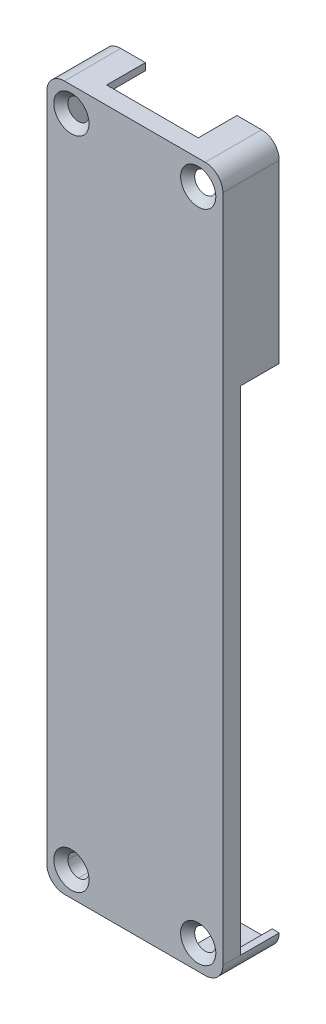
ISO-10303-21;
HEADER;
FILE_DESCRIPTION(('STEP AP214'),'2;1');
FILE_NAME('part.step','',(''),(''),'','','');
FILE_SCHEMA(('AUTOMOTIVE_DESIGN { 1 0 10303 214 1 1 1 1 }'));
ENDSEC;
DATA;
#1=APPLICATION_CONTEXT('core data for automotive mechanical design processes');
#2=APPLICATION_PROTOCOL_DEFINITION('international standard','automotive_design',2000,#1);
#3=PRODUCT_CONTEXT('',#1,'mechanical');
#4=PRODUCT('Part','Part','',(#3));
#5=PRODUCT_RELATED_PRODUCT_CATEGORY('part','',(#4));
#6=PRODUCT_DEFINITION_FORMATION('','',#4);
#7=PRODUCT_DEFINITION_CONTEXT('part definition',#1,'design');
#8=PRODUCT_DEFINITION('design','',#6,#7);
#9=PRODUCT_DEFINITION_SHAPE('','',#8);
#10=(LENGTH_UNIT() NAMED_UNIT(*) SI_UNIT(.MILLI.,.METRE.));
#11=(NAMED_UNIT(*) PLANE_ANGLE_UNIT() SI_UNIT($,.RADIAN.));
#12=(NAMED_UNIT(*) SI_UNIT($,.STERADIAN.) SOLID_ANGLE_UNIT());
#13=UNCERTAINTY_MEASURE_WITH_UNIT(LENGTH_MEASURE(1.E-05),#10,'distance_accuracy_value','');
#14=(GEOMETRIC_REPRESENTATION_CONTEXT(3) GLOBAL_UNCERTAINTY_ASSIGNED_CONTEXT((#13)) GLOBAL_UNIT_ASSIGNED_CONTEXT((#10,
#11,#12)) REPRESENTATION_CONTEXT('',''));
#15=CARTESIAN_POINT('',(0.,0.,0.));
#16=DIRECTION('',(0.,0.,1.));
#17=DIRECTION('',(1.,0.,0.));
#18=AXIS2_PLACEMENT_3D('',#15,#16,#17);
#19=CARTESIAN_POINT('',(0.,0.,0.));
#20=DIRECTION('',(0.,0.,1.));
#21=DIRECTION('',(1.,0.,0.));
#22=AXIS2_PLACEMENT_3D('',#19,#20,#21);
#23=PLANE('',#22);
#24=CARTESIAN_POINT('',(20.,-95.,0.));
#25=DIRECTION('',(0.,0.,1.));
#26=DIRECTION('',(1.,0.,0.));
#27=AXIS2_PLACEMENT_3D('',#24,#25,#26);
#28=CIRCLE('',#27,3.);
#29=CARTESIAN_POINT('',(23.,-95.,0.));
#30=VERTEX_POINT('',#29);
#31=CARTESIAN_POINT('',(20.,-98.,0.));
#32=VERTEX_POINT('',#31);
#33=EDGE_CURVE('E458',#30,#32,#28,.F.);
#34=ORIENTED_EDGE('',*,*,#33,.F.);
#35=DIRECTION('',(1.,0.,0.));
#36=VECTOR('',#35,1.);
#37=CARTESIAN_POINT('',(18.,-95.,0.));
#38=LINE('',#37,#36);
#39=CARTESIAN_POINT('',(25.,-95.,0.));
#40=VERTEX_POINT('',#39);
#41=EDGE_CURVE('E562',#30,#40,#38,.T.);
#42=ORIENTED_EDGE('',*,*,#41,.T.);
#43=CARTESIAN_POINT('',(20.,-95.,0.));
#44=DIRECTION('',(0.,0.,1.));
#45=DIRECTION('',(1.,0.,0.));
#46=AXIS2_PLACEMENT_3D('',#43,#44,#45);
#47=CIRCLE('',#46,5.);
#48=CARTESIAN_POINT('',(20.,-100.,0.));
#49=VERTEX_POINT('',#48);
#50=EDGE_CURVE('E270',#40,#49,#47,.F.);
#51=ORIENTED_EDGE('',*,*,#50,.T.);
#52=DIRECTION('',(1.,0.,0.));
#53=VECTOR('',#52,1.);
#54=CARTESIAN_POINT('',(-25.,-100.,0.));
#55=LINE('',#54,#53);
#56=CARTESIAN_POINT('',(13.,-100.,0.));
#57=VERTEX_POINT('',#56);
#58=EDGE_CURVE('E256',#57,#49,#55,.T.);
#59=ORIENTED_EDGE('',*,*,#58,.F.);
#60=DIRECTION('',(0.,-1.,0.));
#61=VECTOR('',#60,1.);
#62=CARTESIAN_POINT('',(13.,602.219050371606,0.));
#63=LINE('',#62,#61);
#64=CARTESIAN_POINT('',(13.,-98.,0.));
#65=VERTEX_POINT('',#64);
#66=EDGE_CURVE('E494',#65,#57,#63,.T.);
#67=ORIENTED_EDGE('',*,*,#66,.F.);
#68=DIRECTION('',(1.,0.,0.));
#69=VECTOR('',#68,1.);
#70=CARTESIAN_POINT('',(-25.,-98.,0.));
#71=LINE('',#70,#69);
#72=EDGE_CURVE('E463',#65,#32,#71,.T.);
#73=ORIENTED_EDGE('',*,*,#72,.T.);
#74=EDGE_LOOP('',(#34,#42,#51,#59,#67,#73));
#75=FACE_BOUND('',#74,.T.);
#76=ADVANCED_FACE('F36',(#75),#23,.F.);
#77=CARTESIAN_POINT('',(0.,0.,16.));
#78=DIRECTION('',(0.,0.,1.));
#79=DIRECTION('',(1.,0.,0.));
#80=AXIS2_PLACEMENT_3D('',#77,#78,#79);
#81=PLANE('',#80);
#82=CARTESIAN_POINT('',(-18.,-93.,16.));
#83=DIRECTION('',(0.,0.,1.));
#84=DIRECTION('',(1.,0.,0.));
#85=AXIS2_PLACEMENT_3D('',#82,#83,#84);
#86=CIRCLE('',#85,5.);
#87=CARTESIAN_POINT('',(-13.,-93.,16.));
#88=VERTEX_POINT('',#87);
#89=EDGE_CURVE('E11',#88,#88,#86,.F.);
#90=ORIENTED_EDGE('',*,*,#89,.T.);
#91=EDGE_LOOP('',(#90));
#92=FACE_BOUND('',#91,.T.);
#93=CARTESIAN_POINT('',(18.,-93.,16.));
#94=DIRECTION('',(0.,0.,1.));
#95=DIRECTION('',(1.,0.,0.));
#96=AXIS2_PLACEMENT_3D('',#93,#94,#95);
#97=CIRCLE('',#96,5.);
#98=CARTESIAN_POINT('',(23.,-93.,16.));
#99=VERTEX_POINT('',#98);
#100=EDGE_CURVE('E44',#99,#99,#97,.F.);
#101=ORIENTED_EDGE('',*,*,#100,.T.);
#102=EDGE_LOOP('',(#101));
#103=FACE_BOUND('',#102,.T.);
#104=CARTESIAN_POINT('',(-18.,93.,16.));
#105=DIRECTION('',(0.,0.,1.));
#106=DIRECTION('',(1.,0.,0.));
#107=AXIS2_PLACEMENT_3D('',#104,#105,#106);
#108=CIRCLE('',#107,5.00000000000006);
#109=CARTESIAN_POINT('',(-13.,93.,16.));
#110=VERTEX_POINT('',#109);
#111=EDGE_CURVE('E323',#110,#110,#108,.F.);
#112=ORIENTED_EDGE('',*,*,#111,.T.);
#113=EDGE_LOOP('',(#112));
#114=FACE_BOUND('',#113,.T.);
#115=CARTESIAN_POINT('',(18.,93.,16.));
#116=DIRECTION('',(0.,0.,1.));
#117=DIRECTION('',(1.,0.,0.));
#118=AXIS2_PLACEMENT_3D('',#115,#116,#117);
#119=CIRCLE('',#118,5.00000000000006);
#120=CARTESIAN_POINT('',(23.0000000000001,93.,16.));
#121=VERTEX_POINT('',#120);
#122=EDGE_CURVE('E320',#121,#121,#119,.F.);
#123=ORIENTED_EDGE('',*,*,#122,.T.);
#124=EDGE_LOOP('',(#123));
#125=FACE_BOUND('',#124,.T.);
#126=DIRECTION('',(0.,-1.,0.));
#127=VECTOR('',#126,1.);
#128=CARTESIAN_POINT('',(-25.,100.,16.));
#129=LINE('',#128,#127);
#130=CARTESIAN_POINT('',(-25.,95.,16.));
#131=VERTEX_POINT('',#130);
#132=CARTESIAN_POINT('',(-25.,-95.,16.));
#133=VERTEX_POINT('',#132);
#134=EDGE_CURVE('E394',#131,#133,#129,.T.);
#135=ORIENTED_EDGE('',*,*,#134,.T.);
#136=CARTESIAN_POINT('',(-20.,-95.,16.));
#137=DIRECTION('',(0.,0.,1.));
#138=DIRECTION('',(1.,0.,0.));
#139=AXIS2_PLACEMENT_3D('',#136,#137,#138);
#140=CIRCLE('',#139,5.);
#141=CARTESIAN_POINT('',(-20.,-100.,16.));
#142=VERTEX_POINT('',#141);
#143=EDGE_CURVE('E286',#133,#142,#140,.T.);
#144=ORIENTED_EDGE('',*,*,#143,.T.);
#145=DIRECTION('',(1.,0.,0.));
#146=VECTOR('',#145,1.);
#147=CARTESIAN_POINT('',(-25.,-100.,16.));
#148=LINE('',#147,#146);
#149=CARTESIAN_POINT('',(20.,-100.,16.));
#150=VERTEX_POINT('',#149);
#151=EDGE_CURVE('E249',#142,#150,#148,.T.);
#152=ORIENTED_EDGE('',*,*,#151,.T.);
#153=CARTESIAN_POINT('',(20.,-95.,16.));
#154=DIRECTION('',(0.,0.,1.));
#155=DIRECTION('',(1.,0.,0.));
#156=AXIS2_PLACEMENT_3D('',#153,#154,#155);
#157=CIRCLE('',#156,5.);
#158=CARTESIAN_POINT('',(25.,-95.,16.));
#159=VERTEX_POINT('',#158);
#160=EDGE_CURVE('E284',#150,#159,#157,.T.);
#161=ORIENTED_EDGE('',*,*,#160,.T.);
#162=DIRECTION('',(0.,1.,0.));
#163=VECTOR('',#162,1.);
#164=CARTESIAN_POINT('',(25.,100.,16.));
#165=LINE('',#164,#163);
#166=CARTESIAN_POINT('',(25.,95.,16.));
#167=VERTEX_POINT('',#166);
#168=EDGE_CURVE('E260',#159,#167,#165,.T.);
#169=ORIENTED_EDGE('',*,*,#168,.T.);
#170=CARTESIAN_POINT('',(20.,95.,16.));
#171=DIRECTION('',(0.,0.,1.));
#172=DIRECTION('',(1.,0.,0.));
#173=AXIS2_PLACEMENT_3D('',#170,#171,#172);
#174=CIRCLE('',#173,5.);
#175=CARTESIAN_POINT('',(20.,100.,16.));
#176=VERTEX_POINT('',#175);
#177=EDGE_CURVE('E280',#167,#176,#174,.T.);
#178=ORIENTED_EDGE('',*,*,#177,.T.);
#179=DIRECTION('',(-1.,0.,0.));
#180=VECTOR('',#179,1.);
#181=CARTESIAN_POINT('',(-25.,100.,16.));
#182=LINE('',#181,#180);
#183=CARTESIAN_POINT('',(-20.,100.,16.));
#184=VERTEX_POINT('',#183);
#185=EDGE_CURVE('E477',#176,#184,#182,.T.);
#186=ORIENTED_EDGE('',*,*,#185,.T.);
#187=CARTESIAN_POINT('',(-20.,95.,16.));
#188=DIRECTION('',(0.,0.,1.));
#189=DIRECTION('',(1.,0.,0.));
#190=AXIS2_PLACEMENT_3D('',#187,#188,#189);
#191=CIRCLE('',#190,5.);
#192=EDGE_CURVE('E282',#184,#131,#191,.T.);
#193=ORIENTED_EDGE('',*,*,#192,.T.);
#194=EDGE_LOOP('',(#135,#144,#152,#161,#169,#178,#186,#193));
#195=FACE_BOUND('',#194,.T.);
#196=ADVANCED_FACE('F328',(#92,#103,#114,#125,#195),#81,.T.);
#197=CARTESIAN_POINT('',(0.,0.,14.));
#198=DIRECTION('',(0.,0.,1.));
#199=DIRECTION('',(1.,0.,0.));
#200=AXIS2_PLACEMENT_3D('',#197,#198,#199);
#201=PLANE('',#200);
#202=CARTESIAN_POINT('',(-18.,-93.,14.));
#203=DIRECTION('',(0.,0.,1.));
#204=DIRECTION('',(1.,0.,0.));
#205=AXIS2_PLACEMENT_3D('',#202,#203,#204);
#206=CIRCLE('',#205,3.);
#207=CARTESIAN_POINT('',(-15.,-93.,14.));
#208=VERTEX_POINT('',#207);
#209=EDGE_CURVE('E312',#208,#208,#206,.F.);
#210=ORIENTED_EDGE('',*,*,#209,.F.);
#211=EDGE_LOOP('',(#210));
#212=FACE_BOUND('',#211,.T.);
#213=CARTESIAN_POINT('',(18.,93.,14.));
#214=DIRECTION('',(0.,0.,1.));
#215=DIRECTION('',(1.,0.,0.));
#216=AXIS2_PLACEMENT_3D('',#213,#214,#215);
#217=CIRCLE('',#216,3.);
#218=CARTESIAN_POINT('',(21.,93.,14.));
#219=VERTEX_POINT('',#218);
#220=EDGE_CURVE('E309',#219,#219,#217,.T.);
#221=ORIENTED_EDGE('',*,*,#220,.T.);
#222=EDGE_LOOP('',(#221));
#223=FACE_BOUND('',#222,.T.);
#224=CARTESIAN_POINT('',(-18.,93.,14.));
#225=DIRECTION('',(0.,0.,1.));
#226=DIRECTION('',(1.,0.,0.));
#227=AXIS2_PLACEMENT_3D('',#224,#225,#226);
#228=CIRCLE('',#227,3.);
#229=CARTESIAN_POINT('',(-15.,93.,14.));
#230=VERTEX_POINT('',#229);
#231=EDGE_CURVE('E306',#230,#230,#228,.T.);
#232=ORIENTED_EDGE('',*,*,#231,.T.);
#233=EDGE_LOOP('',(#232));
#234=FACE_BOUND('',#233,.T.);
#235=DIRECTION('',(0.,-1.,0.));
#236=VECTOR('',#235,1.);
#237=CARTESIAN_POINT('',(-23.,100.,14.));
#238=LINE('',#237,#236);
#239=CARTESIAN_POINT('',(-23.,95.,14.));
#240=VERTEX_POINT('',#239);
#241=CARTESIAN_POINT('',(-23.,-95.,14.));
#242=VERTEX_POINT('',#241);
#243=EDGE_CURVE('E432',#240,#242,#238,.T.);
#244=ORIENTED_EDGE('',*,*,#243,.F.);
#245=CARTESIAN_POINT('',(-20.,95.,14.));
#246=DIRECTION('',(0.,0.,1.));
#247=DIRECTION('',(1.,0.,0.));
#248=AXIS2_PLACEMENT_3D('',#245,#246,#247);
#249=CIRCLE('',#248,3.);
#250=CARTESIAN_POINT('',(-20.,98.,14.));
#251=VERTEX_POINT('',#250);
#252=EDGE_CURVE('E442',#251,#240,#249,.T.);
#253=ORIENTED_EDGE('',*,*,#252,.F.);
#254=DIRECTION('',(-1.,0.,0.));
#255=VECTOR('',#254,1.);
#256=CARTESIAN_POINT('',(-25.,98.,14.));
#257=LINE('',#256,#255);
#258=CARTESIAN_POINT('',(20.,98.,14.));
#259=VERTEX_POINT('',#258);
#260=EDGE_CURVE('E424',#259,#251,#257,.T.);
#261=ORIENTED_EDGE('',*,*,#260,.F.);
#262=CARTESIAN_POINT('',(20.,95.,14.));
#263=DIRECTION('',(0.,0.,1.));
#264=DIRECTION('',(1.,0.,0.));
#265=AXIS2_PLACEMENT_3D('',#262,#263,#264);
#266=CIRCLE('',#265,3.);
#267=CARTESIAN_POINT('',(23.,95.,14.));
#268=VERTEX_POINT('',#267);
#269=EDGE_CURVE('E443',#268,#259,#266,.T.);
#270=ORIENTED_EDGE('',*,*,#269,.F.);
#271=DIRECTION('',(0.,1.,0.));
#272=VECTOR('',#271,1.);
#273=CARTESIAN_POINT('',(23.,100.,14.));
#274=LINE('',#273,#272);
#275=CARTESIAN_POINT('',(23.,-95.,14.));
#276=VERTEX_POINT('',#275);
#277=EDGE_CURVE('E421',#276,#268,#274,.T.);
#278=ORIENTED_EDGE('',*,*,#277,.F.);
#279=CARTESIAN_POINT('',(20.,-95.,14.));
#280=DIRECTION('',(0.,0.,1.));
#281=DIRECTION('',(1.,0.,0.));
#282=AXIS2_PLACEMENT_3D('',#279,#280,#281);
#283=CIRCLE('',#282,3.);
#284=CARTESIAN_POINT('',(20.,-98.,14.));
#285=VERTEX_POINT('',#284);
#286=EDGE_CURVE('E437',#285,#276,#283,.T.);
#287=ORIENTED_EDGE('',*,*,#286,.F.);
#288=DIRECTION('',(1.,0.,0.));
#289=VECTOR('',#288,1.);
#290=CARTESIAN_POINT('',(-25.,-98.,14.));
#291=LINE('',#290,#289);
#292=CARTESIAN_POINT('',(-20.,-98.,14.));
#293=VERTEX_POINT('',#292);
#294=EDGE_CURVE('E435',#293,#285,#291,.T.);
#295=ORIENTED_EDGE('',*,*,#294,.F.);
#296=CARTESIAN_POINT('',(-20.,-95.,14.));
#297=DIRECTION('',(0.,0.,1.));
#298=DIRECTION('',(1.,0.,0.));
#299=AXIS2_PLACEMENT_3D('',#296,#297,#298);
#300=CIRCLE('',#299,3.);
#301=EDGE_CURVE('E431',#242,#293,#300,.T.);
#302=ORIENTED_EDGE('',*,*,#301,.F.);
#303=EDGE_LOOP('',(#244,#253,#261,#270,#278,#287,#295,#302));
#304=FACE_BOUND('',#303,.T.);
#305=CARTESIAN_POINT('',(18.,-93.,14.));
#306=DIRECTION('',(0.,0.,1.));
#307=DIRECTION('',(1.,0.,0.));
#308=AXIS2_PLACEMENT_3D('',#305,#306,#307);
#309=CIRCLE('',#308,3.);
#310=CARTESIAN_POINT('',(21.,-93.,14.));
#311=VERTEX_POINT('',#310);
#312=EDGE_CURVE('E315',#311,#311,#309,.F.);
#313=ORIENTED_EDGE('',*,*,#312,.F.);
#314=EDGE_LOOP('',(#313));
#315=FACE_BOUND('',#314,.T.);
#316=ADVANCED_FACE('F352',(#212,#223,#234,#304,#315),#201,.F.);
#317=CARTESIAN_POINT('',(-25.,100.,16.));
#318=DIRECTION('',(0.,-1.,0.));
#319=DIRECTION('',(0.,0.,-1.));
#320=AXIS2_PLACEMENT_3D('',#317,#318,#319);
#321=PLANE('',#320);
#322=DIRECTION('',(0.,0.,1.));
#323=VECTOR('',#322,1.);
#324=CARTESIAN_POINT('',(-13.,100.,16.));
#325=LINE('',#324,#323);
#326=CARTESIAN_POINT('',(-13.,100.,0.));
#327=VERTEX_POINT('',#326);
#328=CARTESIAN_POINT('',(-13.,100.,11.));
#329=VERTEX_POINT('',#328);
#330=EDGE_CURVE('E407',#327,#329,#325,.T.);
#331=ORIENTED_EDGE('',*,*,#330,.F.);
#332=DIRECTION('',(-1.,0.,0.));
#333=VECTOR('',#332,1.);
#334=CARTESIAN_POINT('',(-25.,100.,0.));
#335=LINE('',#334,#333);
#336=CARTESIAN_POINT('',(-20.,100.,0.));
#337=VERTEX_POINT('',#336);
#338=EDGE_CURVE('E241',#327,#337,#335,.T.);
#339=ORIENTED_EDGE('',*,*,#338,.T.);
#340=DIRECTION('',(0.,0.,-1.));
#341=VECTOR('',#340,1.);
#342=CARTESIAN_POINT('',(-20.,100.,16.));
#343=LINE('',#342,#341);
#344=EDGE_CURVE('E295',#337,#184,#343,.F.);
#345=ORIENTED_EDGE('',*,*,#344,.T.);
#346=ORIENTED_EDGE('',*,*,#185,.F.);
#347=DIRECTION('',(0.,0.,-1.));
#348=VECTOR('',#347,1.);
#349=CARTESIAN_POINT('',(20.,100.,16.));
#350=LINE('',#349,#348);
#351=CARTESIAN_POINT('',(20.,100.,0.));
#352=VERTEX_POINT('',#351);
#353=EDGE_CURVE('E292',#176,#352,#350,.T.);
#354=ORIENTED_EDGE('',*,*,#353,.T.);
#355=CARTESIAN_POINT('',(13.,100.,0.));
#356=VERTEX_POINT('',#355);
#357=EDGE_CURVE('E244',#352,#356,#335,.T.);
#358=ORIENTED_EDGE('',*,*,#357,.T.);
#359=DIRECTION('',(0.,0.,-1.));
#360=VECTOR('',#359,1.);
#361=CARTESIAN_POINT('',(13.,100.,16.));
#362=LINE('',#361,#360);
#363=CARTESIAN_POINT('',(13.,100.,11.));
#364=VERTEX_POINT('',#363);
#365=EDGE_CURVE('E506',#364,#356,#362,.T.);
#366=ORIENTED_EDGE('',*,*,#365,.F.);
#367=DIRECTION('',(1.,0.,0.));
#368=VECTOR('',#367,1.);
#369=CARTESIAN_POINT('',(-25.,100.,11.));
#370=LINE('',#369,#368);
#371=EDGE_CURVE('E409',#329,#364,#370,.T.);
#372=ORIENTED_EDGE('',*,*,#371,.F.);
#373=EDGE_LOOP('',(#331,#339,#345,#346,#354,#358,#366,#372));
#374=FACE_BOUND('',#373,.T.);
#375=ADVANCED_FACE('F365',(#374),#321,.F.);
#376=CARTESIAN_POINT('',(-25.,-100.,16.));
#377=DIRECTION('',(0.,1.,0.));
#378=DIRECTION('',(0.,0.,1.));
#379=AXIS2_PLACEMENT_3D('',#376,#377,#378);
#380=PLANE('',#379);
#381=DIRECTION('',(0.,0.,-1.));
#382=VECTOR('',#381,1.);
#383=CARTESIAN_POINT('',(-13.,-100.,16.));
#384=LINE('',#383,#382);
#385=CARTESIAN_POINT('',(-13.,-100.,11.));
#386=VERTEX_POINT('',#385);
#387=CARTESIAN_POINT('',(-13.,-100.,0.));
#388=VERTEX_POINT('',#387);
#389=EDGE_CURVE('E380',#386,#388,#384,.T.);
#390=ORIENTED_EDGE('',*,*,#389,.F.);
#391=DIRECTION('',(-1.,0.,0.));
#392=VECTOR('',#391,1.);
#393=CARTESIAN_POINT('',(-25.,-100.,11.));
#394=LINE('',#393,#392);
#395=CARTESIAN_POINT('',(13.,-100.,11.));
#396=VERTEX_POINT('',#395);
#397=EDGE_CURVE('E511',#396,#386,#394,.T.);
#398=ORIENTED_EDGE('',*,*,#397,.F.);
#399=DIRECTION('',(0.,0.,1.));
#400=VECTOR('',#399,1.);
#401=CARTESIAN_POINT('',(13.,-100.,16.));
#402=LINE('',#401,#400);
#403=EDGE_CURVE('E504',#57,#396,#402,.T.);
#404=ORIENTED_EDGE('',*,*,#403,.F.);
#405=ORIENTED_EDGE('',*,*,#58,.T.);
#406=DIRECTION('',(0.,0.,-1.));
#407=VECTOR('',#406,1.);
#408=CARTESIAN_POINT('',(20.,-100.,16.));
#409=LINE('',#408,#407);
#410=EDGE_CURVE('E261',#49,#150,#409,.F.);
#411=ORIENTED_EDGE('',*,*,#410,.T.);
#412=ORIENTED_EDGE('',*,*,#151,.F.);
#413=DIRECTION('',(0.,0.,-1.));
#414=VECTOR('',#413,1.);
#415=CARTESIAN_POINT('',(-20.,-100.,16.));
#416=LINE('',#415,#414);
#417=CARTESIAN_POINT('',(-20.,-100.,0.));
#418=VERTEX_POINT('',#417);
#419=EDGE_CURVE('E263',#142,#418,#416,.T.);
#420=ORIENTED_EDGE('',*,*,#419,.T.);
#421=EDGE_CURVE('E257',#418,#388,#55,.T.);
#422=ORIENTED_EDGE('',*,*,#421,.T.);
#423=EDGE_LOOP('',(#390,#398,#404,#405,#411,#412,#420,#422));
#424=FACE_BOUND('',#423,.T.);
#425=ADVANCED_FACE('F360',(#424),#380,.F.);
#426=DIRECTION('',(0.,-1.,0.));
#427=VECTOR('',#426,1.);
#428=CARTESIAN_POINT('',(-13.,602.219050371606,0.));
#429=LINE('',#428,#427);
#430=CARTESIAN_POINT('',(-13.,-98.,0.));
#431=VERTEX_POINT('',#430);
#432=EDGE_CURVE('E370',#431,#388,#429,.T.);
#433=ORIENTED_EDGE('',*,*,#432,.T.);
#434=ORIENTED_EDGE('',*,*,#421,.F.);
#435=CARTESIAN_POINT('',(-20.,-95.,0.));
#436=DIRECTION('',(0.,0.,1.));
#437=DIRECTION('',(1.,0.,0.));
#438=AXIS2_PLACEMENT_3D('',#435,#436,#437);
#439=CIRCLE('',#438,5.);
#440=CARTESIAN_POINT('',(-25.,-95.,0.));
#441=VERTEX_POINT('',#440);
#442=EDGE_CURVE('E273',#418,#441,#439,.F.);
#443=ORIENTED_EDGE('',*,*,#442,.T.);
#444=DIRECTION('',(0.,-1.,0.));
#445=VECTOR('',#444,1.);
#446=CARTESIAN_POINT('',(-25.,100.,0.));
#447=LINE('',#446,#445);
#448=CARTESIAN_POINT('',(-25.,95.,0.));
#449=VERTEX_POINT('',#448);
#450=EDGE_CURVE('E253',#449,#441,#447,.T.);
#451=ORIENTED_EDGE('',*,*,#450,.F.);
#452=CARTESIAN_POINT('',(-20.,95.,0.));
#453=DIRECTION('',(0.,0.,1.));
#454=DIRECTION('',(1.,0.,0.));
#455=AXIS2_PLACEMENT_3D('',#452,#453,#454);
#456=CIRCLE('',#455,5.);
#457=EDGE_CURVE('E267',#449,#337,#456,.F.);
#458=ORIENTED_EDGE('',*,*,#457,.T.);
#459=ORIENTED_EDGE('',*,*,#338,.F.);
#460=CARTESIAN_POINT('',(-13.,98.0000000000001,0.));
#461=VERTEX_POINT('',#460);
#462=EDGE_CURVE('E375',#327,#461,#429,.T.);
#463=ORIENTED_EDGE('',*,*,#462,.T.);
#464=DIRECTION('',(-1.,0.,0.));
#465=VECTOR('',#464,1.);
#466=CARTESIAN_POINT('',(-25.,98.,0.));
#467=LINE('',#466,#465);
#468=CARTESIAN_POINT('',(-20.,98.,0.));
#469=VERTEX_POINT('',#468);
#470=EDGE_CURVE('E415',#461,#469,#467,.T.);
#471=ORIENTED_EDGE('',*,*,#470,.T.);
#472=CARTESIAN_POINT('',(-20.,95.,0.));
#473=DIRECTION('',(0.,0.,1.));
#474=DIRECTION('',(1.,0.,0.));
#475=AXIS2_PLACEMENT_3D('',#472,#473,#474);
#476=CIRCLE('',#475,3.);
#477=CARTESIAN_POINT('',(-23.,95.,0.));
#478=VERTEX_POINT('',#477);
#479=EDGE_CURVE('E461',#478,#469,#476,.F.);
#480=ORIENTED_EDGE('',*,*,#479,.F.);
#481=DIRECTION('',(0.,-1.,0.));
#482=VECTOR('',#481,1.);
#483=CARTESIAN_POINT('',(-23.,100.,0.));
#484=LINE('',#483,#482);
#485=CARTESIAN_POINT('',(-23.,-95.,0.));
#486=VERTEX_POINT('',#485);
#487=EDGE_CURVE('E465',#478,#486,#484,.T.);
#488=ORIENTED_EDGE('',*,*,#487,.T.);
#489=CARTESIAN_POINT('',(-20.,-95.,0.));
#490=DIRECTION('',(0.,0.,1.));
#491=DIRECTION('',(1.,0.,0.));
#492=AXIS2_PLACEMENT_3D('',#489,#490,#491);
#493=CIRCLE('',#492,3.);
#494=CARTESIAN_POINT('',(-20.,-98.,0.));
#495=VERTEX_POINT('',#494);
#496=EDGE_CURVE('E452',#495,#486,#493,.F.);
#497=ORIENTED_EDGE('',*,*,#496,.F.);
#498=EDGE_CURVE('E373',#495,#431,#71,.T.);
#499=ORIENTED_EDGE('',*,*,#498,.T.);
#500=EDGE_LOOP('',(#433,#434,#443,#451,#458,#459,#463,#471,#480,#488,#497,#499));
#501=FACE_BOUND('',#500,.T.);
#502=ADVANCED_FACE('F347',(#501),#23,.F.);
#503=DIRECTION('',(0.,1.,0.));
#504=VECTOR('',#503,1.);
#505=CARTESIAN_POINT('',(25.,100.,0.));
#506=LINE('',#505,#504);
#507=CARTESIAN_POINT('',(25.,45.,0.));
#508=VERTEX_POINT('',#507);
#509=CARTESIAN_POINT('',(25.,95.,0.));
#510=VERTEX_POINT('',#509);
#511=EDGE_CURVE('E232',#508,#510,#506,.T.);
#512=ORIENTED_EDGE('',*,*,#511,.F.);
#513=DIRECTION('',(1.,0.,0.));
#514=VECTOR('',#513,1.);
#515=CARTESIAN_POINT('',(18.,45.,0.));
#516=LINE('',#515,#514);
#517=CARTESIAN_POINT('',(23.,45.,0.));
#518=VERTEX_POINT('',#517);
#519=EDGE_CURVE('E215',#518,#508,#516,.T.);
#520=ORIENTED_EDGE('',*,*,#519,.F.);
#521=DIRECTION('',(0.,1.,0.));
#522=VECTOR('',#521,1.);
#523=CARTESIAN_POINT('',(23.,100.,0.));
#524=LINE('',#523,#522);
#525=CARTESIAN_POINT('',(23.,95.,0.));
#526=VERTEX_POINT('',#525);
#527=EDGE_CURVE('E413',#518,#526,#524,.T.);
#528=ORIENTED_EDGE('',*,*,#527,.T.);
#529=CARTESIAN_POINT('',(20.,95.,0.));
#530=DIRECTION('',(0.,0.,1.));
#531=DIRECTION('',(1.,0.,0.));
#532=AXIS2_PLACEMENT_3D('',#529,#530,#531);
#533=CIRCLE('',#532,3.);
#534=CARTESIAN_POINT('',(20.,98.,0.));
#535=VERTEX_POINT('',#534);
#536=EDGE_CURVE('E456',#535,#526,#533,.F.);
#537=ORIENTED_EDGE('',*,*,#536,.F.);
#538=CARTESIAN_POINT('',(13.,98.,0.));
#539=VERTEX_POINT('',#538);
#540=EDGE_CURVE('E468',#535,#539,#467,.T.);
#541=ORIENTED_EDGE('',*,*,#540,.T.);
#542=EDGE_CURVE('E51',#356,#539,#63,.T.);
#543=ORIENTED_EDGE('',*,*,#542,.F.);
#544=ORIENTED_EDGE('',*,*,#357,.F.);
#545=CARTESIAN_POINT('',(20.,95.,0.));
#546=DIRECTION('',(0.,0.,1.));
#547=DIRECTION('',(1.,0.,0.));
#548=AXIS2_PLACEMENT_3D('',#545,#546,#547);
#549=CIRCLE('',#548,5.);
#550=EDGE_CURVE('E239',#352,#510,#549,.F.);
#551=ORIENTED_EDGE('',*,*,#550,.T.);
#552=EDGE_LOOP('',(#512,#520,#528,#537,#541,#543,#544,#551));
#553=FACE_BOUND('',#552,.T.);
#554=ADVANCED_FACE('F237',(#553),#23,.F.);
#555=CARTESIAN_POINT('',(-25.,98.,16.));
#556=DIRECTION('',(0.,-1.,0.));
#557=DIRECTION('',(0.,0.,-1.));
#558=AXIS2_PLACEMENT_3D('',#555,#556,#557);
#559=PLANE('',#558);
#560=ORIENTED_EDGE('',*,*,#470,.F.);
#561=DIRECTION('',(0.,0.,1.));
#562=VECTOR('',#561,1.);
#563=CARTESIAN_POINT('',(-13.,98.,16.));
#564=LINE('',#563,#562);
#565=CARTESIAN_POINT('',(-13.,98.0000000000001,11.));
#566=VERTEX_POINT('',#565);
#567=EDGE_CURVE('E417',#461,#566,#564,.T.);
#568=ORIENTED_EDGE('',*,*,#567,.T.);
#569=DIRECTION('',(1.,0.,0.));
#570=VECTOR('',#569,1.);
#571=CARTESIAN_POINT('',(-25.,98.,11.));
#572=LINE('',#571,#570);
#573=CARTESIAN_POINT('',(13.,98.0000000000001,11.));
#574=VERTEX_POINT('',#573);
#575=EDGE_CURVE('E508',#566,#574,#572,.T.);
#576=ORIENTED_EDGE('',*,*,#575,.T.);
#577=DIRECTION('',(0.,0.,-1.));
#578=VECTOR('',#577,1.);
#579=CARTESIAN_POINT('',(13.,98.,16.));
#580=LINE('',#579,#578);
#581=EDGE_CURVE('E502',#574,#539,#580,.T.);
#582=ORIENTED_EDGE('',*,*,#581,.T.);
#583=ORIENTED_EDGE('',*,*,#540,.F.);
#584=DIRECTION('',(0.,0.,-1.));
#585=VECTOR('',#584,1.);
#586=CARTESIAN_POINT('',(20.,98.,16.));
#587=LINE('',#586,#585);
#588=EDGE_CURVE('E246',#259,#535,#587,.T.);
#589=ORIENTED_EDGE('',*,*,#588,.F.);
#590=ORIENTED_EDGE('',*,*,#260,.T.);
#591=DIRECTION('',(0.,0.,-1.));
#592=VECTOR('',#591,1.);
#593=CARTESIAN_POINT('',(-20.,98.,16.));
#594=LINE('',#593,#592);
#595=EDGE_CURVE('E242',#469,#251,#594,.F.);
#596=ORIENTED_EDGE('',*,*,#595,.F.);
#597=EDGE_LOOP('',(#560,#568,#576,#582,#583,#589,#590,#596));
#598=FACE_BOUND('',#597,.T.);
#599=ADVANCED_FACE('F358',(#598),#559,.T.);
#600=CARTESIAN_POINT('',(-25.,-98.,16.));
#601=DIRECTION('',(0.,1.,0.));
#602=DIRECTION('',(0.,0.,1.));
#603=AXIS2_PLACEMENT_3D('',#600,#601,#602);
#604=PLANE('',#603);
#605=DIRECTION('',(-1.,0.,0.));
#606=VECTOR('',#605,1.);
#607=CARTESIAN_POINT('',(-25.,-98.,11.));
#608=LINE('',#607,#606);
#609=CARTESIAN_POINT('',(13.,-98.,11.));
#610=VERTEX_POINT('',#609);
#611=CARTESIAN_POINT('',(-13.,-98.,11.));
#612=VERTEX_POINT('',#611);
#613=EDGE_CURVE('E300',#610,#612,#608,.T.);
#614=ORIENTED_EDGE('',*,*,#613,.T.);
#615=DIRECTION('',(0.,0.,-1.));
#616=VECTOR('',#615,1.);
#617=CARTESIAN_POINT('',(-13.,-98.,16.));
#618=LINE('',#617,#616);
#619=EDGE_CURVE('E303',#612,#431,#618,.T.);
#620=ORIENTED_EDGE('',*,*,#619,.T.);
#621=ORIENTED_EDGE('',*,*,#498,.F.);
#622=DIRECTION('',(0.,0.,1.));
#623=VECTOR('',#622,1.);
#624=CARTESIAN_POINT('',(-20.,-98.,16.));
#625=LINE('',#624,#623);
#626=EDGE_CURVE('E454',#293,#495,#625,.F.);
#627=ORIENTED_EDGE('',*,*,#626,.F.);
#628=ORIENTED_EDGE('',*,*,#294,.T.);
#629=DIRECTION('',(0.,0.,1.));
#630=VECTOR('',#629,1.);
#631=CARTESIAN_POINT('',(20.,-98.,16.));
#632=LINE('',#631,#630);
#633=EDGE_CURVE('E440',#32,#285,#632,.T.);
#634=ORIENTED_EDGE('',*,*,#633,.F.);
#635=ORIENTED_EDGE('',*,*,#72,.F.);
#636=DIRECTION('',(0.,0.,1.));
#637=VECTOR('',#636,1.);
#638=CARTESIAN_POINT('',(13.,-98.,16.));
#639=LINE('',#638,#637);
#640=EDGE_CURVE('E297',#65,#610,#639,.T.);
#641=ORIENTED_EDGE('',*,*,#640,.T.);
#642=EDGE_LOOP('',(#614,#620,#621,#627,#628,#634,#635,#641));
#643=FACE_BOUND('',#642,.T.);
#644=ADVANCED_FACE('F552',(#643),#604,.T.);
#645=CARTESIAN_POINT('',(25.,100.,16.));
#646=DIRECTION('',(-1.,0.,0.));
#647=DIRECTION('',(0.,-1.,0.));
#648=AXIS2_PLACEMENT_3D('',#645,#646,#647);
#649=PLANE('',#648);
#650=DIRECTION('',(0.,0.,-1.));
#651=VECTOR('',#650,1.);
#652=CARTESIAN_POINT('',(25.,-95.,16.));
#653=LINE('',#652,#651);
#654=CARTESIAN_POINT('',(25.,-95.,11.));
#655=VERTEX_POINT('',#654);
#656=EDGE_CURVE('E290',#159,#655,#653,.T.);
#657=ORIENTED_EDGE('',*,*,#656,.T.);
#658=DIRECTION('',(0.,-1.,0.));
#659=VECTOR('',#658,1.);
#660=CARTESIAN_POINT('',(25.,45.,11.));
#661=LINE('',#660,#659);
#662=CARTESIAN_POINT('',(25.,45.,11.));
#663=VERTEX_POINT('',#662);
#664=EDGE_CURVE('E235',#663,#655,#661,.T.);
#665=ORIENTED_EDGE('',*,*,#664,.F.);
#666=DIRECTION('',(0.,0.,1.));
#667=VECTOR('',#666,1.);
#668=CARTESIAN_POINT('',(25.,45.,0.));
#669=LINE('',#668,#667);
#670=EDGE_CURVE('E219',#508,#663,#669,.T.);
#671=ORIENTED_EDGE('',*,*,#670,.F.);
#672=ORIENTED_EDGE('',*,*,#511,.T.);
#673=DIRECTION('',(0.,0.,-1.));
#674=VECTOR('',#673,1.);
#675=CARTESIAN_POINT('',(25.,95.,16.));
#676=LINE('',#675,#674);
#677=EDGE_CURVE('E288',#510,#167,#676,.F.);
#678=ORIENTED_EDGE('',*,*,#677,.T.);
#679=ORIENTED_EDGE('',*,*,#168,.F.);
#680=EDGE_LOOP('',(#657,#665,#671,#672,#678,#679));
#681=FACE_BOUND('',#680,.T.);
#682=ADVANCED_FACE('F231',(#681),#649,.F.);
#683=CARTESIAN_POINT('',(-25.,100.,16.));
#684=DIRECTION('',(1.,0.,0.));
#685=DIRECTION('',(0.,1.,0.));
#686=AXIS2_PLACEMENT_3D('',#683,#684,#685);
#687=PLANE('',#686);
#688=ORIENTED_EDGE('',*,*,#450,.T.);
#689=DIRECTION('',(0.,0.,-1.));
#690=VECTOR('',#689,1.);
#691=CARTESIAN_POINT('',(-25.,-95.,16.));
#692=LINE('',#691,#690);
#693=EDGE_CURVE('E278',#441,#133,#692,.F.);
#694=ORIENTED_EDGE('',*,*,#693,.T.);
#695=ORIENTED_EDGE('',*,*,#134,.F.);
#696=DIRECTION('',(0.,0.,-1.));
#697=VECTOR('',#696,1.);
#698=CARTESIAN_POINT('',(-25.,95.,16.));
#699=LINE('',#698,#697);
#700=EDGE_CURVE('E275',#131,#449,#699,.T.);
#701=ORIENTED_EDGE('',*,*,#700,.T.);
#702=EDGE_LOOP('',(#688,#694,#695,#701));
#703=FACE_BOUND('',#702,.T.);
#704=ADVANCED_FACE('F390',(#703),#687,.F.);
#705=CARTESIAN_POINT('',(-20.,-95.,16.));
#706=DIRECTION('',(0.,0.,-1.));
#707=DIRECTION('',(-1.,0.,0.));
#708=AXIS2_PLACEMENT_3D('',#705,#706,#707);
#709=CYLINDRICAL_SURFACE('',#708,5.);
#710=ORIENTED_EDGE('',*,*,#143,.F.);
#711=ORIENTED_EDGE('',*,*,#693,.F.);
#712=ORIENTED_EDGE('',*,*,#442,.F.);
#713=ORIENTED_EDGE('',*,*,#419,.F.);
#714=EDGE_LOOP('',(#710,#711,#712,#713));
#715=FACE_BOUND('',#714,.T.);
#716=ADVANCED_FACE('F386',(#715),#709,.T.);
#717=CARTESIAN_POINT('',(20.,-95.,16.));
#718=DIRECTION('',(0.,0.,-1.));
#719=DIRECTION('',(-1.,0.,0.));
#720=AXIS2_PLACEMENT_3D('',#717,#718,#719);
#721=CYLINDRICAL_SURFACE('',#720,5.);
#722=ORIENTED_EDGE('',*,*,#160,.F.);
#723=ORIENTED_EDGE('',*,*,#410,.F.);
#724=ORIENTED_EDGE('',*,*,#50,.F.);
#725=DIRECTION('',(0.,0.,-1.));
#726=VECTOR('',#725,1.);
#727=CARTESIAN_POINT('',(25.,-95.,11.));
#728=LINE('',#727,#726);
#729=EDGE_CURVE('E227',#655,#40,#728,.T.);
#730=ORIENTED_EDGE('',*,*,#729,.F.);
#731=ORIENTED_EDGE('',*,*,#656,.F.);
#732=EDGE_LOOP('',(#722,#723,#724,#730,#731));
#733=FACE_BOUND('',#732,.T.);
#734=ADVANCED_FACE('F484',(#733),#721,.T.);
#735=CARTESIAN_POINT('',(-20.,95.,16.));
#736=DIRECTION('',(0.,0.,-1.));
#737=DIRECTION('',(-1.,0.,0.));
#738=AXIS2_PLACEMENT_3D('',#735,#736,#737);
#739=CYLINDRICAL_SURFACE('',#738,5.);
#740=ORIENTED_EDGE('',*,*,#192,.F.);
#741=ORIENTED_EDGE('',*,*,#344,.F.);
#742=ORIENTED_EDGE('',*,*,#457,.F.);
#743=ORIENTED_EDGE('',*,*,#700,.F.);
#744=EDGE_LOOP('',(#740,#741,#742,#743));
#745=FACE_BOUND('',#744,.T.);
#746=ADVANCED_FACE('F397',(#745),#739,.T.);
#747=CARTESIAN_POINT('',(20.,95.,16.));
#748=DIRECTION('',(0.,0.,-1.));
#749=DIRECTION('',(-1.,0.,0.));
#750=AXIS2_PLACEMENT_3D('',#747,#748,#749);
#751=CYLINDRICAL_SURFACE('',#750,5.);
#752=ORIENTED_EDGE('',*,*,#177,.F.);
#753=ORIENTED_EDGE('',*,*,#677,.F.);
#754=ORIENTED_EDGE('',*,*,#550,.F.);
#755=ORIENTED_EDGE('',*,*,#353,.F.);
#756=EDGE_LOOP('',(#752,#753,#754,#755));
#757=FACE_BOUND('',#756,.T.);
#758=ADVANCED_FACE('F490',(#757),#751,.T.);
#759=CARTESIAN_POINT('',(23.,100.,16.));
#760=DIRECTION('',(-1.,0.,0.));
#761=DIRECTION('',(0.,-1.,0.));
#762=AXIS2_PLACEMENT_3D('',#759,#760,#761);
#763=PLANE('',#762);
#764=DIRECTION('',(0.,1.,0.));
#765=VECTOR('',#764,1.);
#766=CARTESIAN_POINT('',(23.,100.,11.));
#767=LINE('',#766,#765);
#768=CARTESIAN_POINT('',(23.,-95.,11.));
#769=VERTEX_POINT('',#768);
#770=CARTESIAN_POINT('',(23.,45.,11.));
#771=VERTEX_POINT('',#770);
#772=EDGE_CURVE('E318',#769,#771,#767,.T.);
#773=ORIENTED_EDGE('',*,*,#772,.F.);
#774=DIRECTION('',(0.,0.,1.));
#775=VECTOR('',#774,1.);
#776=CARTESIAN_POINT('',(23.,-95.,16.));
#777=LINE('',#776,#775);
#778=EDGE_CURVE('E425',#276,#769,#777,.F.);
#779=ORIENTED_EDGE('',*,*,#778,.F.);
#780=ORIENTED_EDGE('',*,*,#277,.T.);
#781=DIRECTION('',(0.,0.,1.));
#782=VECTOR('',#781,1.);
#783=CARTESIAN_POINT('',(23.,95.,16.));
#784=LINE('',#783,#782);
#785=EDGE_CURVE('E429',#526,#268,#784,.T.);
#786=ORIENTED_EDGE('',*,*,#785,.F.);
#787=ORIENTED_EDGE('',*,*,#527,.F.);
#788=DIRECTION('',(0.,0.,-1.));
#789=VECTOR('',#788,1.);
#790=CARTESIAN_POINT('',(23.,45.,16.));
#791=LINE('',#790,#789);
#792=EDGE_CURVE('E222',#771,#518,#791,.T.);
#793=ORIENTED_EDGE('',*,*,#792,.F.);
#794=EDGE_LOOP('',(#773,#779,#780,#786,#787,#793));
#795=FACE_BOUND('',#794,.T.);
#796=ADVANCED_FACE('F528',(#795),#763,.T.);
#797=CARTESIAN_POINT('',(-23.,100.,16.));
#798=DIRECTION('',(1.,0.,0.));
#799=DIRECTION('',(0.,1.,0.));
#800=AXIS2_PLACEMENT_3D('',#797,#798,#799);
#801=PLANE('',#800);
#802=ORIENTED_EDGE('',*,*,#487,.F.);
#803=DIRECTION('',(0.,0.,1.));
#804=VECTOR('',#803,1.);
#805=CARTESIAN_POINT('',(-23.,95.,16.));
#806=LINE('',#805,#804);
#807=EDGE_CURVE('E450',#240,#478,#806,.F.);
#808=ORIENTED_EDGE('',*,*,#807,.F.);
#809=ORIENTED_EDGE('',*,*,#243,.T.);
#810=DIRECTION('',(0.,0.,1.));
#811=VECTOR('',#810,1.);
#812=CARTESIAN_POINT('',(-23.,-95.,16.));
#813=LINE('',#812,#811);
#814=EDGE_CURVE('E445',#486,#242,#813,.T.);
#815=ORIENTED_EDGE('',*,*,#814,.F.);
#816=EDGE_LOOP('',(#802,#808,#809,#815));
#817=FACE_BOUND('',#816,.T.);
#818=ADVANCED_FACE('F545',(#817),#801,.T.);
#819=CARTESIAN_POINT('',(-20.,-95.,16.));
#820=DIRECTION('',(0.,0.,-1.));
#821=DIRECTION('',(-1.,0.,0.));
#822=AXIS2_PLACEMENT_3D('',#819,#820,#821);
#823=CYLINDRICAL_SURFACE('',#822,3.);
#824=ORIENTED_EDGE('',*,*,#301,.T.);
#825=ORIENTED_EDGE('',*,*,#626,.T.);
#826=ORIENTED_EDGE('',*,*,#496,.T.);
#827=ORIENTED_EDGE('',*,*,#814,.T.);
#828=EDGE_LOOP('',(#824,#825,#826,#827));
#829=FACE_BOUND('',#828,.T.);
#830=ADVANCED_FACE('F548',(#829),#823,.F.);
#831=CARTESIAN_POINT('',(20.,-95.,16.));
#832=DIRECTION('',(0.,0.,-1.));
#833=DIRECTION('',(-1.,0.,0.));
#834=AXIS2_PLACEMENT_3D('',#831,#832,#833);
#835=CYLINDRICAL_SURFACE('',#834,3.);
#836=ORIENTED_EDGE('',*,*,#286,.T.);
#837=ORIENTED_EDGE('',*,*,#778,.T.);
#838=EDGE_CURVE('E428',#769,#30,#777,.F.);
#839=ORIENTED_EDGE('',*,*,#838,.T.);
#840=ORIENTED_EDGE('',*,*,#33,.T.);
#841=ORIENTED_EDGE('',*,*,#633,.T.);
#842=EDGE_LOOP('',(#836,#837,#839,#840,#841));
#843=FACE_BOUND('',#842,.T.);
#844=ADVANCED_FACE('F575',(#843),#835,.F.);
#845=CARTESIAN_POINT('',(-20.,95.,16.));
#846=DIRECTION('',(0.,0.,-1.));
#847=DIRECTION('',(-1.,0.,0.));
#848=AXIS2_PLACEMENT_3D('',#845,#846,#847);
#849=CYLINDRICAL_SURFACE('',#848,3.);
#850=ORIENTED_EDGE('',*,*,#252,.T.);
#851=ORIENTED_EDGE('',*,*,#807,.T.);
#852=ORIENTED_EDGE('',*,*,#479,.T.);
#853=ORIENTED_EDGE('',*,*,#595,.T.);
#854=EDGE_LOOP('',(#850,#851,#852,#853));
#855=FACE_BOUND('',#854,.T.);
#856=ADVANCED_FACE('F539',(#855),#849,.F.);
#857=CARTESIAN_POINT('',(20.,95.,16.));
#858=DIRECTION('',(0.,0.,-1.));
#859=DIRECTION('',(-1.,0.,0.));
#860=AXIS2_PLACEMENT_3D('',#857,#858,#859);
#861=CYLINDRICAL_SURFACE('',#860,3.);
#862=ORIENTED_EDGE('',*,*,#269,.T.);
#863=ORIENTED_EDGE('',*,*,#588,.T.);
#864=ORIENTED_EDGE('',*,*,#536,.T.);
#865=ORIENTED_EDGE('',*,*,#785,.T.);
#866=EDGE_LOOP('',(#862,#863,#864,#865));
#867=FACE_BOUND('',#866,.T.);
#868=ADVANCED_FACE('F525',(#867),#861,.F.);
#869=CARTESIAN_POINT('',(13.,602.219050371606,11.));
#870=DIRECTION('',(-1.,0.,0.));
#871=DIRECTION('',(0.,0.,1.));
#872=AXIS2_PLACEMENT_3D('',#869,#870,#871);
#873=PLANE('',#872);
#874=ORIENTED_EDGE('',*,*,#66,.T.);
#875=ORIENTED_EDGE('',*,*,#403,.T.);
#876=DIRECTION('',(0.,-1.,0.));
#877=VECTOR('',#876,1.);
#878=CARTESIAN_POINT('',(13.,602.219050371606,11.));
#879=LINE('',#878,#877);
#880=EDGE_CURVE('E59',#610,#396,#879,.T.);
#881=ORIENTED_EDGE('',*,*,#880,.F.);
#882=ORIENTED_EDGE('',*,*,#640,.F.);
#883=EDGE_LOOP('',(#874,#875,#881,#882));
#884=FACE_BOUND('',#883,.T.);
#885=ADVANCED_FACE('F577',(#884),#873,.T.);
#886=CARTESIAN_POINT('',(-13.,602.219050371606,11.));
#887=DIRECTION('',(0.,0.,-1.));
#888=DIRECTION('',(-1.,0.,0.));
#889=AXIS2_PLACEMENT_3D('',#886,#887,#888);
#890=PLANE('',#889);
#891=ORIENTED_EDGE('',*,*,#880,.T.);
#892=ORIENTED_EDGE('',*,*,#397,.T.);
#893=DIRECTION('',(0.,-1.,0.));
#894=VECTOR('',#893,1.);
#895=CARTESIAN_POINT('',(-13.,602.219050371606,11.));
#896=LINE('',#895,#894);
#897=EDGE_CURVE('E493',#612,#386,#896,.T.);
#898=ORIENTED_EDGE('',*,*,#897,.F.);
#899=ORIENTED_EDGE('',*,*,#613,.F.);
#900=EDGE_LOOP('',(#891,#892,#898,#899));
#901=FACE_BOUND('',#900,.T.);
#902=ADVANCED_FACE('F556',(#901),#890,.T.);
#903=CARTESIAN_POINT('',(-13.,602.219050371606,0.));
#904=DIRECTION('',(1.,0.,0.));
#905=DIRECTION('',(0.,0.,-1.));
#906=AXIS2_PLACEMENT_3D('',#903,#904,#905);
#907=PLANE('',#906);
#908=ORIENTED_EDGE('',*,*,#897,.T.);
#909=ORIENTED_EDGE('',*,*,#389,.T.);
#910=ORIENTED_EDGE('',*,*,#432,.F.);
#911=ORIENTED_EDGE('',*,*,#619,.F.);
#912=EDGE_LOOP('',(#908,#909,#910,#911));
#913=FACE_BOUND('',#912,.T.);
#914=ADVANCED_FACE('F554',(#913),#907,.T.);
#915=ORIENTED_EDGE('',*,*,#462,.F.);
#916=ORIENTED_EDGE('',*,*,#330,.T.);
#917=EDGE_CURVE('E376',#329,#566,#896,.T.);
#918=ORIENTED_EDGE('',*,*,#917,.T.);
#919=ORIENTED_EDGE('',*,*,#567,.F.);
#920=EDGE_LOOP('',(#915,#916,#918,#919));
#921=FACE_BOUND('',#920,.T.);
#922=ADVANCED_FACE('F516',(#921),#907,.T.);
#923=ORIENTED_EDGE('',*,*,#917,.F.);
#924=ORIENTED_EDGE('',*,*,#371,.T.);
#925=EDGE_CURVE('E498',#364,#574,#879,.T.);
#926=ORIENTED_EDGE('',*,*,#925,.T.);
#927=ORIENTED_EDGE('',*,*,#575,.F.);
#928=EDGE_LOOP('',(#923,#924,#926,#927));
#929=FACE_BOUND('',#928,.T.);
#930=ADVANCED_FACE('F518',(#929),#890,.T.);
#931=ORIENTED_EDGE('',*,*,#925,.F.);
#932=ORIENTED_EDGE('',*,*,#365,.T.);
#933=ORIENTED_EDGE('',*,*,#542,.T.);
#934=ORIENTED_EDGE('',*,*,#581,.F.);
#935=EDGE_LOOP('',(#931,#932,#933,#934));
#936=FACE_BOUND('',#935,.T.);
#937=ADVANCED_FACE('F521',(#936),#873,.T.);
#938=CARTESIAN_POINT('',(18.,-95.,11.));
#939=DIRECTION('',(0.,-1.,0.));
#940=DIRECTION('',(1.,0.,0.));
#941=AXIS2_PLACEMENT_3D('',#938,#939,#940);
#942=PLANE('',#941);
#943=DIRECTION('',(1.,0.,0.));
#944=VECTOR('',#943,1.);
#945=CARTESIAN_POINT('',(18.,-95.,11.));
#946=LINE('',#945,#944);
#947=EDGE_CURVE('E565',#769,#655,#946,.T.);
#948=ORIENTED_EDGE('',*,*,#947,.T.);
#949=ORIENTED_EDGE('',*,*,#729,.T.);
#950=ORIENTED_EDGE('',*,*,#41,.F.);
#951=ORIENTED_EDGE('',*,*,#838,.F.);
#952=EDGE_LOOP('',(#948,#949,#950,#951));
#953=FACE_BOUND('',#952,.T.);
#954=ADVANCED_FACE('F588',(#953),#942,.F.);
#955=CARTESIAN_POINT('',(18.,45.,11.));
#956=DIRECTION('',(0.,0.,1.));
#957=DIRECTION('',(0.,-1.,0.));
#958=AXIS2_PLACEMENT_3D('',#955,#956,#957);
#959=PLANE('',#958);
#960=ORIENTED_EDGE('',*,*,#772,.T.);
#961=DIRECTION('',(1.,0.,0.));
#962=VECTOR('',#961,1.);
#963=CARTESIAN_POINT('',(18.,45.,11.));
#964=LINE('',#963,#962);
#965=EDGE_CURVE('E226',#771,#663,#964,.T.);
#966=ORIENTED_EDGE('',*,*,#965,.T.);
#967=ORIENTED_EDGE('',*,*,#664,.T.);
#968=ORIENTED_EDGE('',*,*,#947,.F.);
#969=EDGE_LOOP('',(#960,#966,#967,#968));
#970=FACE_BOUND('',#969,.T.);
#971=ADVANCED_FACE('F572',(#970),#959,.F.);
#972=CARTESIAN_POINT('',(18.,45.,0.));
#973=DIRECTION('',(0.,1.,0.));
#974=DIRECTION('',(-1.,0.,0.));
#975=AXIS2_PLACEMENT_3D('',#972,#973,#974);
#976=PLANE('',#975);
#977=ORIENTED_EDGE('',*,*,#792,.T.);
#978=ORIENTED_EDGE('',*,*,#519,.T.);
#979=ORIENTED_EDGE('',*,*,#670,.T.);
#980=ORIENTED_EDGE('',*,*,#965,.F.);
#981=EDGE_LOOP('',(#977,#978,#979,#980));
#982=FACE_BOUND('',#981,.T.);
#983=ADVANCED_FACE('F217',(#982),#976,.F.);
#984=CARTESIAN_POINT('',(-18.,-93.,16.));
#985=DIRECTION('',(0.,0.,1.));
#986=DIRECTION('',(1.,0.,0.));
#987=AXIS2_PLACEMENT_3D('',#984,#985,#986);
#988=CONICAL_SURFACE('',#987,5.,0.785398163397444);
#989=ORIENTED_EDGE('',*,*,#209,.T.);
#990=EDGE_LOOP('',(#989));
#991=FACE_BOUND('',#990,.T.);
#992=ORIENTED_EDGE('',*,*,#89,.F.);
#993=EDGE_LOOP('',(#992));
#994=FACE_BOUND('',#993,.T.);
#995=ADVANCED_FACE('F334',(#991,#994),#988,.F.);
#996=CARTESIAN_POINT('',(18.,-93.,16.));
#997=DIRECTION('',(0.,0.,1.));
#998=DIRECTION('',(1.,0.,0.));
#999=AXIS2_PLACEMENT_3D('',#996,#997,#998);
#1000=CONICAL_SURFACE('',#999,5.,0.785398163397444);
#1001=ORIENTED_EDGE('',*,*,#312,.T.);
#1002=EDGE_LOOP('',(#1001));
#1003=FACE_BOUND('',#1002,.T.);
#1004=ORIENTED_EDGE('',*,*,#100,.F.);
#1005=EDGE_LOOP('',(#1004));
#1006=FACE_BOUND('',#1005,.T.);
#1007=ADVANCED_FACE('F331',(#1003,#1006),#1000,.F.);
#1008=CARTESIAN_POINT('',(-18.,93.,14.));
#1009=DIRECTION('',(0.,0.,1.));
#1010=DIRECTION('',(1.,0.,0.));
#1011=AXIS2_PLACEMENT_3D('',#1008,#1009,#1010);
#1012=CONICAL_SURFACE('',#1011,3.,0.785398163397453);
#1013=ORIENTED_EDGE('',*,*,#111,.F.);
#1014=EDGE_LOOP('',(#1013));
#1015=FACE_BOUND('',#1014,.T.);
#1016=ORIENTED_EDGE('',*,*,#231,.F.);
#1017=EDGE_LOOP('',(#1016));
#1018=FACE_BOUND('',#1017,.T.);
#1019=ADVANCED_FACE('F333',(#1015,#1018),#1012,.F.);
#1020=CARTESIAN_POINT('',(18.,93.,14.));
#1021=DIRECTION('',(0.,0.,1.));
#1022=DIRECTION('',(1.,0.,0.));
#1023=AXIS2_PLACEMENT_3D('',#1020,#1021,#1022);
#1024=CONICAL_SURFACE('',#1023,3.,0.785398163397452);
#1025=ORIENTED_EDGE('',*,*,#122,.F.);
#1026=EDGE_LOOP('',(#1025));
#1027=FACE_BOUND('',#1026,.T.);
#1028=ORIENTED_EDGE('',*,*,#220,.F.);
#1029=EDGE_LOOP('',(#1028));
#1030=FACE_BOUND('',#1029,.T.);
#1031=ADVANCED_FACE('F38',(#1027,#1030),#1024,.F.);
#1032=CLOSED_SHELL('',(#76,#196,#316,#375,#425,#502,#554,#599,#644,#682,#704,#716,#734,#746,
#758,#796,#818,#830,#844,#856,#868,#885,#902,#914,#922,#930,#937,#954,#971,#983,#995,#1007,
#1019,#1031));
#1033=MANIFOLD_SOLID_BREP('B2',#1032);
#1034=ADVANCED_BREP_SHAPE_REPRESENTATION('',(#18,#1033),#14);
#1035=SHAPE_DEFINITION_REPRESENTATION(#9,#1034);
ENDSEC;
END-ISO-10303-21;
